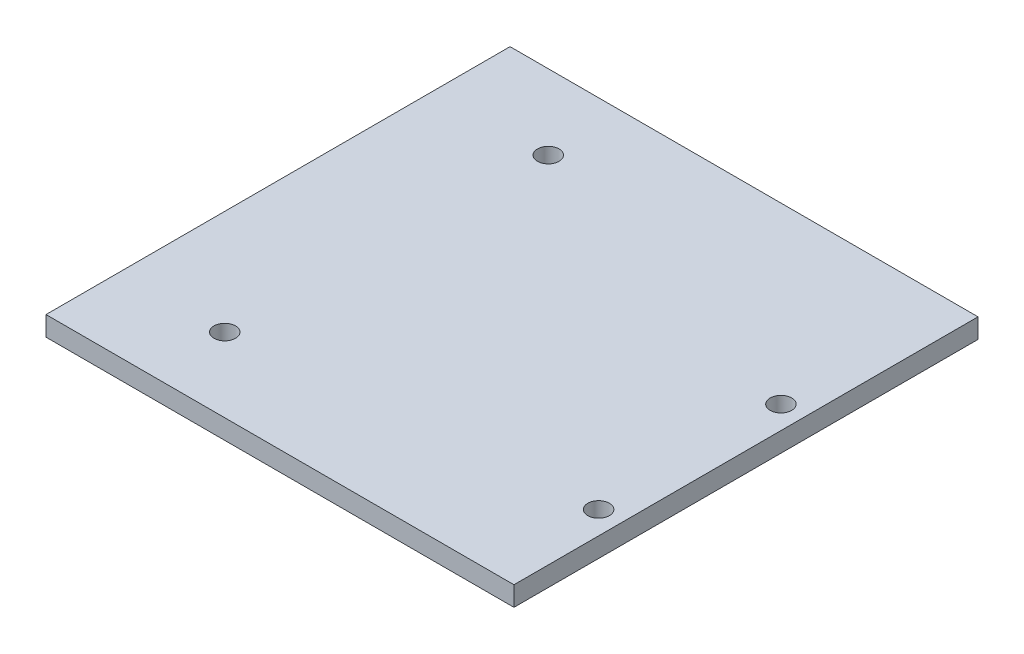
ISO-10303-21;
HEADER;
FILE_DESCRIPTION(('STEP AP214'),'2;1');
FILE_NAME('part.step','',(''),(''),'','','');
FILE_SCHEMA(('AUTOMOTIVE_DESIGN { 1 0 10303 214 1 1 1 1 }'));
ENDSEC;
DATA;
#1=APPLICATION_CONTEXT('core data for automotive mechanical design processes');
#2=APPLICATION_PROTOCOL_DEFINITION('international standard','automotive_design',2000,#1);
#3=PRODUCT_CONTEXT('',#1,'mechanical');
#4=PRODUCT('Part','Part','',(#3));
#5=PRODUCT_RELATED_PRODUCT_CATEGORY('part','',(#4));
#6=PRODUCT_DEFINITION_FORMATION('','',#4);
#7=PRODUCT_DEFINITION_CONTEXT('part definition',#1,'design');
#8=PRODUCT_DEFINITION('design','',#6,#7);
#9=PRODUCT_DEFINITION_SHAPE('','',#8);
#10=(LENGTH_UNIT() NAMED_UNIT(*) SI_UNIT(.MILLI.,.METRE.));
#11=(NAMED_UNIT(*) PLANE_ANGLE_UNIT() SI_UNIT($,.RADIAN.));
#12=(NAMED_UNIT(*) SI_UNIT($,.STERADIAN.) SOLID_ANGLE_UNIT());
#13=UNCERTAINTY_MEASURE_WITH_UNIT(LENGTH_MEASURE(1.E-05),#10,'distance_accuracy_value','');
#14=(GEOMETRIC_REPRESENTATION_CONTEXT(3) GLOBAL_UNCERTAINTY_ASSIGNED_CONTEXT((#13)) GLOBAL_UNIT_ASSIGNED_CONTEXT((#10,
#11,#12)) REPRESENTATION_CONTEXT('',''));
#15=CARTESIAN_POINT('',(0.,0.,0.));
#16=DIRECTION('',(0.,0.,1.));
#17=DIRECTION('',(1.,0.,0.));
#18=AXIS2_PLACEMENT_3D('',#15,#16,#17);
#19=CARTESIAN_POINT('',(1.86249251356684,2.99999999999999,-31.4167782418358));
#20=DIRECTION('',(1.,0.,0.));
#21=DIRECTION('',(0.,0.,-1.));
#22=AXIS2_PLACEMENT_3D('',#19,#20,#21);
#23=PLANE('',#22);
#24=DIRECTION('',(0.,0.,1.));
#25=VECTOR('',#24,1.);
#26=CARTESIAN_POINT('',(1.86249251356684,0.,-31.4167782418358));
#27=LINE('',#26,#25);
#28=CARTESIAN_POINT('',(1.86249251356684,0.,-31.4167782418358));
#29=VERTEX_POINT('',#28);
#30=CARTESIAN_POINT('',(1.86249251356685,0.,39.5832217581642));
#31=VERTEX_POINT('',#30);
#32=EDGE_CURVE('E95',#29,#31,#27,.T.);
#33=ORIENTED_EDGE('',*,*,#32,.T.);
#34=DIRECTION('',(0.,-1.,0.));
#35=VECTOR('',#34,1.);
#36=CARTESIAN_POINT('',(1.86249251356685,2.99999999999999,39.5832217581642));
#37=LINE('',#36,#35);
#38=CARTESIAN_POINT('',(1.86249251356685,2.99999999999999,39.5832217581642));
#39=VERTEX_POINT('',#38);
#40=EDGE_CURVE('E11',#39,#31,#37,.T.);
#41=ORIENTED_EDGE('',*,*,#40,.F.);
#42=DIRECTION('',(0.,0.,1.));
#43=VECTOR('',#42,1.);
#44=CARTESIAN_POINT('',(1.86249251356684,2.99999999999999,-31.4167782418358));
#45=LINE('',#44,#43);
#46=CARTESIAN_POINT('',(1.86249251356684,2.99999999999999,-31.4167782418358));
#47=VERTEX_POINT('',#46);
#48=EDGE_CURVE('E83',#47,#39,#45,.T.);
#49=ORIENTED_EDGE('',*,*,#48,.F.);
#50=DIRECTION('',(0.,-1.,0.));
#51=VECTOR('',#50,1.);
#52=CARTESIAN_POINT('',(1.86249251356684,2.99999999999999,-31.4167782418358));
#53=LINE('',#52,#51);
#54=EDGE_CURVE('E91',#47,#29,#53,.T.);
#55=ORIENTED_EDGE('',*,*,#54,.T.);
#56=EDGE_LOOP('',(#33,#41,#49,#55));
#57=FACE_BOUND('',#56,.T.);
#58=ADVANCED_FACE('F32',(#57),#23,.F.);
#59=CARTESIAN_POINT('',(1.86249251356685,2.99999999999999,39.5832217581642));
#60=DIRECTION('',(0.,0.,-1.));
#61=DIRECTION('',(-1.,0.,0.));
#62=AXIS2_PLACEMENT_3D('',#59,#60,#61);
#63=PLANE('',#62);
#64=DIRECTION('',(1.,0.,0.));
#65=VECTOR('',#64,1.);
#66=CARTESIAN_POINT('',(1.86249251356685,0.,39.5832217581642));
#67=LINE('',#66,#65);
#68=CARTESIAN_POINT('',(73.4624925135668,0.,39.5832217581642));
#69=VERTEX_POINT('',#68);
#70=EDGE_CURVE('E87',#31,#69,#67,.T.);
#71=ORIENTED_EDGE('',*,*,#70,.T.);
#72=DIRECTION('',(0.,-1.,0.));
#73=VECTOR('',#72,1.);
#74=CARTESIAN_POINT('',(73.4624925135668,2.99999999999999,39.5832217581642));
#75=LINE('',#74,#73);
#76=CARTESIAN_POINT('',(73.4624925135668,2.99999999999999,39.5832217581642));
#77=VERTEX_POINT('',#76);
#78=EDGE_CURVE('E40',#77,#69,#75,.T.);
#79=ORIENTED_EDGE('',*,*,#78,.F.);
#80=DIRECTION('',(1.,0.,0.));
#81=VECTOR('',#80,1.);
#82=CARTESIAN_POINT('',(1.86249251356685,2.99999999999999,39.5832217581642));
#83=LINE('',#82,#81);
#84=EDGE_CURVE('E78',#39,#77,#83,.T.);
#85=ORIENTED_EDGE('',*,*,#84,.F.);
#86=ORIENTED_EDGE('',*,*,#40,.T.);
#87=EDGE_LOOP('',(#71,#79,#85,#86));
#88=FACE_BOUND('',#87,.T.);
#89=ADVANCED_FACE('F86',(#88),#63,.F.);
#90=CARTESIAN_POINT('',(73.4624925135668,2.99999999999999,-31.4167782418358));
#91=DIRECTION('',(-1.,0.,0.));
#92=DIRECTION('',(0.,0.,1.));
#93=AXIS2_PLACEMENT_3D('',#90,#91,#92);
#94=PLANE('',#93);
#95=DIRECTION('',(0.,0.,-1.));
#96=VECTOR('',#95,1.);
#97=CARTESIAN_POINT('',(73.4624925135668,0.,-31.4167782418358));
#98=LINE('',#97,#96);
#99=CARTESIAN_POINT('',(73.4624925135668,0.,-31.4167782418358));
#100=VERTEX_POINT('',#99);
#101=EDGE_CURVE('E65',#69,#100,#98,.T.);
#102=ORIENTED_EDGE('',*,*,#101,.T.);
#103=DIRECTION('',(0.,-1.,0.));
#104=VECTOR('',#103,1.);
#105=CARTESIAN_POINT('',(73.4624925135668,2.99999999999999,-31.4167782418358));
#106=LINE('',#105,#104);
#107=CARTESIAN_POINT('',(73.4624925135668,2.99999999999999,-31.4167782418358));
#108=VERTEX_POINT('',#107);
#109=EDGE_CURVE('E88',#108,#100,#106,.T.);
#110=ORIENTED_EDGE('',*,*,#109,.F.);
#111=DIRECTION('',(0.,0.,-1.));
#112=VECTOR('',#111,1.);
#113=CARTESIAN_POINT('',(73.4624925135668,2.99999999999999,-31.4167782418358));
#114=LINE('',#113,#112);
#115=EDGE_CURVE('E81',#77,#108,#114,.T.);
#116=ORIENTED_EDGE('',*,*,#115,.F.);
#117=ORIENTED_EDGE('',*,*,#78,.T.);
#118=EDGE_LOOP('',(#102,#110,#116,#117));
#119=FACE_BOUND('',#118,.T.);
#120=ADVANCED_FACE('F89',(#119),#94,.F.);
#121=CARTESIAN_POINT('',(1.86249251356684,2.99999999999999,-31.4167782418358));
#122=DIRECTION('',(0.,0.,1.));
#123=DIRECTION('',(1.,0.,0.));
#124=AXIS2_PLACEMENT_3D('',#121,#122,#123);
#125=PLANE('',#124);
#126=DIRECTION('',(-1.,0.,0.));
#127=VECTOR('',#126,1.);
#128=CARTESIAN_POINT('',(1.86249251356684,0.,-31.4167782418358));
#129=LINE('',#128,#127);
#130=EDGE_CURVE('E71',#100,#29,#129,.T.);
#131=ORIENTED_EDGE('',*,*,#130,.T.);
#132=ORIENTED_EDGE('',*,*,#54,.F.);
#133=DIRECTION('',(-1.,0.,0.));
#134=VECTOR('',#133,1.);
#135=CARTESIAN_POINT('',(1.86249251356684,2.99999999999999,-31.4167782418358));
#136=LINE('',#135,#134);
#137=EDGE_CURVE('E48',#108,#47,#136,.T.);
#138=ORIENTED_EDGE('',*,*,#137,.F.);
#139=ORIENTED_EDGE('',*,*,#109,.T.);
#140=EDGE_LOOP('',(#131,#132,#138,#139));
#141=FACE_BOUND('',#140,.T.);
#142=ADVANCED_FACE('F103',(#141),#125,.F.);
#143=CARTESIAN_POINT('',(0.,2.99999999999999,0.));
#144=DIRECTION('',(0.,1.,0.));
#145=DIRECTION('',(0.,0.,1.));
#146=AXIS2_PLACEMENT_3D('',#143,#144,#145);
#147=PLANE('',#146);
#148=CARTESIAN_POINT('',(69.9624925135668,2.99999999999999,23.1332217581642));
#149=DIRECTION('',(0.,1.,0.));
#150=DIRECTION('',(0.,0.,1.));
#151=AXIS2_PLACEMENT_3D('',#148,#149,#150);
#152=CIRCLE('',#151,1.65);
#153=CARTESIAN_POINT('',(69.9624925135668,2.99999999999999,24.7832217581642));
#154=VERTEX_POINT('',#153);
#155=EDGE_CURVE('E127',#154,#154,#152,.T.);
#156=ORIENTED_EDGE('',*,*,#155,.F.);
#157=EDGE_LOOP('',(#156));
#158=FACE_BOUND('',#157,.T.);
#159=CARTESIAN_POINT('',(69.9624925135668,2.99999999999999,-4.76677824183579));
#160=DIRECTION('',(0.,1.,0.));
#161=DIRECTION('',(0.,0.,1.));
#162=AXIS2_PLACEMENT_3D('',#159,#160,#161);
#163=CIRCLE('',#162,1.65);
#164=CARTESIAN_POINT('',(69.9624925135668,2.99999999999999,-3.11677824183579));
#165=VERTEX_POINT('',#164);
#166=EDGE_CURVE('E121',#165,#165,#163,.T.);
#167=ORIENTED_EDGE('',*,*,#166,.F.);
#168=EDGE_LOOP('',(#167));
#169=FACE_BOUND('',#168,.T.);
#170=CARTESIAN_POINT('',(17.8624925135668,2.99999999999999,28.2332217581642));
#171=DIRECTION('',(0.,1.,0.));
#172=DIRECTION('',(0.,0.,1.));
#173=AXIS2_PLACEMENT_3D('',#170,#171,#172);
#174=CIRCLE('',#173,1.65);
#175=CARTESIAN_POINT('',(17.8624925135668,2.99999999999999,29.8832217581642));
#176=VERTEX_POINT('',#175);
#177=EDGE_CURVE('E115',#176,#176,#174,.T.);
#178=ORIENTED_EDGE('',*,*,#177,.F.);
#179=EDGE_LOOP('',(#178));
#180=FACE_BOUND('',#179,.T.);
#181=CARTESIAN_POINT('',(19.1624925135668,2.99999999999999,-19.9667782418358));
#182=DIRECTION('',(0.,1.,0.));
#183=DIRECTION('',(0.,0.,1.));
#184=AXIS2_PLACEMENT_3D('',#181,#182,#183);
#185=CIRCLE('',#184,1.65);
#186=CARTESIAN_POINT('',(19.1624925135668,2.99999999999999,-18.3167782418358));
#187=VERTEX_POINT('',#186);
#188=EDGE_CURVE('E109',#187,#187,#185,.T.);
#189=ORIENTED_EDGE('',*,*,#188,.F.);
#190=EDGE_LOOP('',(#189));
#191=FACE_BOUND('',#190,.T.);
#192=ORIENTED_EDGE('',*,*,#48,.T.);
#193=ORIENTED_EDGE('',*,*,#84,.T.);
#194=ORIENTED_EDGE('',*,*,#115,.T.);
#195=ORIENTED_EDGE('',*,*,#137,.T.);
#196=EDGE_LOOP('',(#192,#193,#194,#195));
#197=FACE_BOUND('',#196,.T.);
#198=ADVANCED_FACE('F79',(#158,#169,#180,#191,#197),#147,.T.);
#199=CARTESIAN_POINT('',(0.,0.,0.));
#200=DIRECTION('',(0.,1.,0.));
#201=DIRECTION('',(0.,0.,1.));
#202=AXIS2_PLACEMENT_3D('',#199,#200,#201);
#203=PLANE('',#202);
#204=CARTESIAN_POINT('',(69.9624925135668,0.,23.1332217581642));
#205=DIRECTION('',(0.,1.,0.));
#206=DIRECTION('',(0.,0.,1.));
#207=AXIS2_PLACEMENT_3D('',#204,#205,#206);
#208=CIRCLE('',#207,1.65);
#209=CARTESIAN_POINT('',(69.9624925135668,0.,24.7832217581642));
#210=VERTEX_POINT('',#209);
#211=EDGE_CURVE('E124',#210,#210,#208,.T.);
#212=ORIENTED_EDGE('',*,*,#211,.T.);
#213=EDGE_LOOP('',(#212));
#214=FACE_BOUND('',#213,.T.);
#215=CARTESIAN_POINT('',(69.9624925135668,0.,-4.76677824183579));
#216=DIRECTION('',(0.,1.,0.));
#217=DIRECTION('',(0.,0.,1.));
#218=AXIS2_PLACEMENT_3D('',#215,#216,#217);
#219=CIRCLE('',#218,1.65);
#220=CARTESIAN_POINT('',(69.9624925135668,0.,-3.11677824183579));
#221=VERTEX_POINT('',#220);
#222=EDGE_CURVE('E118',#221,#221,#219,.T.);
#223=ORIENTED_EDGE('',*,*,#222,.T.);
#224=EDGE_LOOP('',(#223));
#225=FACE_BOUND('',#224,.T.);
#226=CARTESIAN_POINT('',(17.8624925135668,0.,28.2332217581642));
#227=DIRECTION('',(0.,1.,0.));
#228=DIRECTION('',(0.,0.,1.));
#229=AXIS2_PLACEMENT_3D('',#226,#227,#228);
#230=CIRCLE('',#229,1.65);
#231=CARTESIAN_POINT('',(17.8624925135668,0.,29.8832217581642));
#232=VERTEX_POINT('',#231);
#233=EDGE_CURVE('E112',#232,#232,#230,.T.);
#234=ORIENTED_EDGE('',*,*,#233,.T.);
#235=EDGE_LOOP('',(#234));
#236=FACE_BOUND('',#235,.T.);
#237=CARTESIAN_POINT('',(19.1624925135668,0.,-19.9667782418358));
#238=DIRECTION('',(0.,1.,0.));
#239=DIRECTION('',(0.,0.,1.));
#240=AXIS2_PLACEMENT_3D('',#237,#238,#239);
#241=CIRCLE('',#240,1.65);
#242=CARTESIAN_POINT('',(19.1624925135668,0.,-18.3167782418358));
#243=VERTEX_POINT('',#242);
#244=EDGE_CURVE('E98',#243,#243,#241,.T.);
#245=ORIENTED_EDGE('',*,*,#244,.T.);
#246=EDGE_LOOP('',(#245));
#247=FACE_BOUND('',#246,.T.);
#248=ORIENTED_EDGE('',*,*,#32,.F.);
#249=ORIENTED_EDGE('',*,*,#130,.F.);
#250=ORIENTED_EDGE('',*,*,#101,.F.);
#251=ORIENTED_EDGE('',*,*,#70,.F.);
#252=EDGE_LOOP('',(#248,#249,#250,#251));
#253=FACE_BOUND('',#252,.T.);
#254=ADVANCED_FACE('F106',(#214,#225,#236,#247,#253),#203,.F.);
#255=CARTESIAN_POINT('',(19.1624925135668,0.,-19.9667782418358));
#256=DIRECTION('',(0.,1.,0.));
#257=DIRECTION('',(0.,0.,1.));
#258=AXIS2_PLACEMENT_3D('',#255,#256,#257);
#259=CYLINDRICAL_SURFACE('',#258,1.65);
#260=ORIENTED_EDGE('',*,*,#244,.F.);
#261=EDGE_LOOP('',(#260));
#262=FACE_BOUND('',#261,.T.);
#263=ORIENTED_EDGE('',*,*,#188,.T.);
#264=EDGE_LOOP('',(#263));
#265=FACE_BOUND('',#264,.T.);
#266=ADVANCED_FACE('F151',(#262,#265),#259,.F.);
#267=CARTESIAN_POINT('',(17.8624925135668,0.,28.2332217581642));
#268=DIRECTION('',(0.,1.,0.));
#269=DIRECTION('',(0.,0.,1.));
#270=AXIS2_PLACEMENT_3D('',#267,#268,#269);
#271=CYLINDRICAL_SURFACE('',#270,1.65);
#272=ORIENTED_EDGE('',*,*,#233,.F.);
#273=EDGE_LOOP('',(#272));
#274=FACE_BOUND('',#273,.T.);
#275=ORIENTED_EDGE('',*,*,#177,.T.);
#276=EDGE_LOOP('',(#275));
#277=FACE_BOUND('',#276,.T.);
#278=ADVANCED_FACE('F153',(#274,#277),#271,.F.);
#279=CARTESIAN_POINT('',(69.9624925135668,0.,-4.76677824183579));
#280=DIRECTION('',(0.,1.,0.));
#281=DIRECTION('',(0.,0.,1.));
#282=AXIS2_PLACEMENT_3D('',#279,#280,#281);
#283=CYLINDRICAL_SURFACE('',#282,1.65);
#284=ORIENTED_EDGE('',*,*,#222,.F.);
#285=EDGE_LOOP('',(#284));
#286=FACE_BOUND('',#285,.T.);
#287=ORIENTED_EDGE('',*,*,#166,.T.);
#288=EDGE_LOOP('',(#287));
#289=FACE_BOUND('',#288,.T.);
#290=ADVANCED_FACE('F138',(#286,#289),#283,.F.);
#291=CARTESIAN_POINT('',(69.9624925135668,0.,23.1332217581642));
#292=DIRECTION('',(0.,1.,0.));
#293=DIRECTION('',(0.,0.,1.));
#294=AXIS2_PLACEMENT_3D('',#291,#292,#293);
#295=CYLINDRICAL_SURFACE('',#294,1.65);
#296=ORIENTED_EDGE('',*,*,#211,.F.);
#297=EDGE_LOOP('',(#296));
#298=FACE_BOUND('',#297,.T.);
#299=ORIENTED_EDGE('',*,*,#155,.T.);
#300=EDGE_LOOP('',(#299));
#301=FACE_BOUND('',#300,.T.);
#302=ADVANCED_FACE('F135',(#298,#301),#295,.F.);
#303=CLOSED_SHELL('',(#58,#89,#120,#142,#198,#254,#266,#278,#290,#302));
#304=MANIFOLD_SOLID_BREP('B2',#303);
#305=ADVANCED_BREP_SHAPE_REPRESENTATION('',(#18,#304),#14);
#306=SHAPE_DEFINITION_REPRESENTATION(#9,#305);
ENDSEC;
END-ISO-10303-21;
